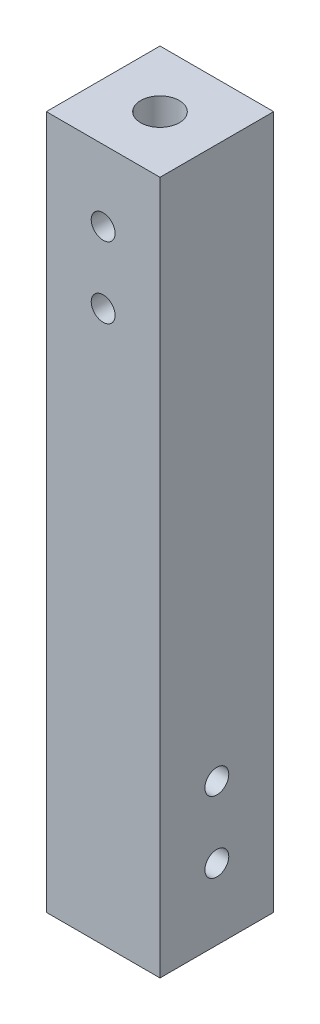
ISO-10303-21;
HEADER;
FILE_DESCRIPTION(('STEP AP214'),'2;1');
FILE_NAME('part.step','',(''),(''),'','','');
FILE_SCHEMA(('AUTOMOTIVE_DESIGN { 1 0 10303 214 1 1 1 1 }'));
ENDSEC;
DATA;
#1=APPLICATION_CONTEXT('core data for automotive mechanical design processes');
#2=APPLICATION_PROTOCOL_DEFINITION('international standard','automotive_design',2000,#1);
#3=PRODUCT_CONTEXT('',#1,'mechanical');
#4=PRODUCT('Part','Part','',(#3));
#5=PRODUCT_RELATED_PRODUCT_CATEGORY('part','',(#4));
#6=PRODUCT_DEFINITION_FORMATION('','',#4);
#7=PRODUCT_DEFINITION_CONTEXT('part definition',#1,'design');
#8=PRODUCT_DEFINITION('design','',#6,#7);
#9=PRODUCT_DEFINITION_SHAPE('','',#8);
#10=(LENGTH_UNIT() NAMED_UNIT(*) SI_UNIT(.MILLI.,.METRE.));
#11=(NAMED_UNIT(*) PLANE_ANGLE_UNIT() SI_UNIT($,.RADIAN.));
#12=(NAMED_UNIT(*) SI_UNIT($,.STERADIAN.) SOLID_ANGLE_UNIT());
#13=UNCERTAINTY_MEASURE_WITH_UNIT(LENGTH_MEASURE(1.E-05),#10,'distance_accuracy_value','');
#14=(GEOMETRIC_REPRESENTATION_CONTEXT(3) GLOBAL_UNCERTAINTY_ASSIGNED_CONTEXT((#13)) GLOBAL_UNIT_ASSIGNED_CONTEXT((#10,
#11,#12)) REPRESENTATION_CONTEXT('',''));
#15=CARTESIAN_POINT('',(0.,0.,0.));
#16=DIRECTION('',(0.,0.,1.));
#17=DIRECTION('',(1.,0.,0.));
#18=AXIS2_PLACEMENT_3D('',#15,#16,#17);
#19=CARTESIAN_POINT('',(0.,122.,0.));
#20=DIRECTION('',(0.,0.,-1.));
#21=DIRECTION('',(-1.,0.,0.));
#22=AXIS2_PLACEMENT_3D('',#19,#20,#21);
#23=PLANE('',#22);
#24=CARTESIAN_POINT('',(10.,97.,0.));
#25=DIRECTION('',(0.,0.,1.));
#26=DIRECTION('',(1.,0.,0.));
#27=AXIS2_PLACEMENT_3D('',#24,#25,#26);
#28=CIRCLE('',#27,2.1);
#29=CARTESIAN_POINT('',(12.1,97.,0.));
#30=VERTEX_POINT('',#29);
#31=EDGE_CURVE('E142',#30,#30,#28,.T.);
#32=ORIENTED_EDGE('',*,*,#31,.F.);
#33=EDGE_LOOP('',(#32));
#34=FACE_BOUND('',#33,.T.);
#35=DIRECTION('',(1.,0.,0.));
#36=VECTOR('',#35,1.);
#37=CARTESIAN_POINT('',(0.,0.,0.));
#38=LINE('',#37,#36);
#39=CARTESIAN_POINT('',(0.,0.,0.));
#40=VERTEX_POINT('',#39);
#41=CARTESIAN_POINT('',(20.,0.,0.));
#42=VERTEX_POINT('',#41);
#43=EDGE_CURVE('E187',#40,#42,#38,.T.);
#44=ORIENTED_EDGE('',*,*,#43,.T.);
#45=DIRECTION('',(0.,-1.,0.));
#46=VECTOR('',#45,1.);
#47=CARTESIAN_POINT('',(20.,122.,0.));
#48=LINE('',#47,#46);
#49=CARTESIAN_POINT('',(20.,122.,0.));
#50=VERTEX_POINT('',#49);
#51=EDGE_CURVE('E61',#50,#42,#48,.T.);
#52=ORIENTED_EDGE('',*,*,#51,.F.);
#53=DIRECTION('',(1.,0.,0.));
#54=VECTOR('',#53,1.);
#55=CARTESIAN_POINT('',(0.,122.,0.));
#56=LINE('',#55,#54);
#57=CARTESIAN_POINT('',(0.,122.,0.));
#58=VERTEX_POINT('',#57);
#59=EDGE_CURVE('E101',#58,#50,#56,.T.);
#60=ORIENTED_EDGE('',*,*,#59,.F.);
#61=DIRECTION('',(0.,-1.,0.));
#62=VECTOR('',#61,1.);
#63=CARTESIAN_POINT('',(0.,122.,0.));
#64=LINE('',#63,#62);
#65=EDGE_CURVE('E11',#58,#40,#64,.T.);
#66=ORIENTED_EDGE('',*,*,#65,.T.);
#67=EDGE_LOOP('',(#44,#52,#60,#66));
#68=FACE_BOUND('',#67,.T.);
#69=CARTESIAN_POINT('',(10.,109.5,0.));
#70=DIRECTION('',(0.,0.,1.));
#71=DIRECTION('',(1.,0.,0.));
#72=AXIS2_PLACEMENT_3D('',#69,#70,#71);
#73=CIRCLE('',#72,2.1);
#74=CARTESIAN_POINT('',(12.1,109.5,0.));
#75=VERTEX_POINT('',#74);
#76=EDGE_CURVE('E150',#75,#75,#73,.T.);
#77=ORIENTED_EDGE('',*,*,#76,.F.);
#78=EDGE_LOOP('',(#77));
#79=FACE_BOUND('',#78,.T.);
#80=ADVANCED_FACE('F45',(#34,#68,#79),#23,.F.);
#81=CARTESIAN_POINT('',(0.,122.,0.));
#82=DIRECTION('',(1.,0.,0.));
#83=DIRECTION('',(0.,0.,-1.));
#84=AXIS2_PLACEMENT_3D('',#81,#82,#83);
#85=PLANE('',#84);
#86=DIRECTION('',(0.,0.,1.));
#87=VECTOR('',#86,1.);
#88=CARTESIAN_POINT('',(0.,0.,0.));
#89=LINE('',#88,#87);
#90=CARTESIAN_POINT('',(0.,0.,-20.));
#91=VERTEX_POINT('',#90);
#92=EDGE_CURVE('E172',#91,#40,#89,.T.);
#93=ORIENTED_EDGE('',*,*,#92,.T.);
#94=ORIENTED_EDGE('',*,*,#65,.F.);
#95=DIRECTION('',(0.,0.,1.));
#96=VECTOR('',#95,1.);
#97=CARTESIAN_POINT('',(0.,122.,0.));
#98=LINE('',#97,#96);
#99=CARTESIAN_POINT('',(0.,122.,-20.));
#100=VERTEX_POINT('',#99);
#101=EDGE_CURVE('E173',#100,#58,#98,.T.);
#102=ORIENTED_EDGE('',*,*,#101,.F.);
#103=DIRECTION('',(0.,-1.,0.));
#104=VECTOR('',#103,1.);
#105=CARTESIAN_POINT('',(0.,122.,-20.));
#106=LINE('',#105,#104);
#107=EDGE_CURVE('E183',#100,#91,#106,.T.);
#108=ORIENTED_EDGE('',*,*,#107,.T.);
#109=EDGE_LOOP('',(#93,#94,#102,#108));
#110=FACE_BOUND('',#109,.T.);
#111=ADVANCED_FACE('F47',(#110),#85,.F.);
#112=CARTESIAN_POINT('',(20.,122.,0.));
#113=DIRECTION('',(-1.,0.,0.));
#114=DIRECTION('',(0.,0.,1.));
#115=AXIS2_PLACEMENT_3D('',#112,#113,#114);
#116=PLANE('',#115);
#117=CARTESIAN_POINT('',(20.,25.,-10.));
#118=DIRECTION('',(1.,0.,0.));
#119=DIRECTION('',(0.,0.,-1.));
#120=AXIS2_PLACEMENT_3D('',#117,#118,#119);
#121=CIRCLE('',#120,2.09999999999999);
#122=CARTESIAN_POINT('',(20.,25.,-12.1));
#123=VERTEX_POINT('',#122);
#124=EDGE_CURVE('E132',#123,#123,#121,.T.);
#125=ORIENTED_EDGE('',*,*,#124,.F.);
#126=EDGE_LOOP('',(#125));
#127=FACE_BOUND('',#126,.T.);
#128=CARTESIAN_POINT('',(20.,12.5,-10.));
#129=DIRECTION('',(1.,0.,0.));
#130=DIRECTION('',(0.,0.,-1.));
#131=AXIS2_PLACEMENT_3D('',#128,#129,#130);
#132=CIRCLE('',#131,2.09999999999999);
#133=CARTESIAN_POINT('',(20.,12.5,-12.1));
#134=VERTEX_POINT('',#133);
#135=EDGE_CURVE('E131',#134,#134,#132,.T.);
#136=ORIENTED_EDGE('',*,*,#135,.F.);
#137=EDGE_LOOP('',(#136));
#138=FACE_BOUND('',#137,.T.);
#139=DIRECTION('',(0.,0.,-1.));
#140=VECTOR('',#139,1.);
#141=CARTESIAN_POINT('',(20.,0.,0.));
#142=LINE('',#141,#140);
#143=CARTESIAN_POINT('',(20.,0.,-20.));
#144=VERTEX_POINT('',#143);
#145=EDGE_CURVE('E88',#42,#144,#142,.T.);
#146=ORIENTED_EDGE('',*,*,#145,.T.);
#147=DIRECTION('',(0.,-1.,0.));
#148=VECTOR('',#147,1.);
#149=CARTESIAN_POINT('',(20.,122.,-20.));
#150=LINE('',#149,#148);
#151=CARTESIAN_POINT('',(20.,122.,-20.));
#152=VERTEX_POINT('',#151);
#153=EDGE_CURVE('E196',#152,#144,#150,.T.);
#154=ORIENTED_EDGE('',*,*,#153,.F.);
#155=DIRECTION('',(0.,0.,-1.));
#156=VECTOR('',#155,1.);
#157=CARTESIAN_POINT('',(20.,122.,0.));
#158=LINE('',#157,#156);
#159=EDGE_CURVE('E178',#50,#152,#158,.T.);
#160=ORIENTED_EDGE('',*,*,#159,.F.);
#161=ORIENTED_EDGE('',*,*,#51,.T.);
#162=EDGE_LOOP('',(#146,#154,#160,#161));
#163=FACE_BOUND('',#162,.T.);
#164=ADVANCED_FACE('F258',(#127,#138,#163),#116,.F.);
#165=CARTESIAN_POINT('',(0.,122.,-20.));
#166=DIRECTION('',(0.,0.,1.));
#167=DIRECTION('',(1.,0.,0.));
#168=AXIS2_PLACEMENT_3D('',#165,#166,#167);
#169=PLANE('',#168);
#170=DIRECTION('',(-1.,0.,0.));
#171=VECTOR('',#170,1.);
#172=CARTESIAN_POINT('',(0.,0.,-20.));
#173=LINE('',#172,#171);
#174=EDGE_CURVE('E94',#144,#91,#173,.T.);
#175=ORIENTED_EDGE('',*,*,#174,.T.);
#176=ORIENTED_EDGE('',*,*,#107,.F.);
#177=DIRECTION('',(-1.,0.,0.));
#178=VECTOR('',#177,1.);
#179=CARTESIAN_POINT('',(0.,122.,-20.));
#180=LINE('',#179,#178);
#181=EDGE_CURVE('E70',#152,#100,#180,.T.);
#182=ORIENTED_EDGE('',*,*,#181,.F.);
#183=ORIENTED_EDGE('',*,*,#153,.T.);
#184=EDGE_LOOP('',(#175,#176,#182,#183));
#185=FACE_BOUND('',#184,.T.);
#186=ADVANCED_FACE('F264',(#185),#169,.F.);
#187=CARTESIAN_POINT('',(0.,122.,0.));
#188=DIRECTION('',(0.,-1.,0.));
#189=DIRECTION('',(0.,0.,-1.));
#190=AXIS2_PLACEMENT_3D('',#187,#188,#189);
#191=PLANE('',#190);
#192=CARTESIAN_POINT('',(10.,122.,-10.));
#193=DIRECTION('',(0.,1.,0.));
#194=DIRECTION('',(0.,0.,1.));
#195=AXIS2_PLACEMENT_3D('',#192,#193,#194);
#196=CIRCLE('',#195,3.39999999999999);
#197=CARTESIAN_POINT('',(10.,122.,-6.60000000000001));
#198=VERTEX_POINT('',#197);
#199=EDGE_CURVE('E164',#198,#198,#196,.T.);
#200=ORIENTED_EDGE('',*,*,#199,.F.);
#201=EDGE_LOOP('',(#200));
#202=FACE_BOUND('',#201,.T.);
#203=ORIENTED_EDGE('',*,*,#101,.T.);
#204=ORIENTED_EDGE('',*,*,#59,.T.);
#205=ORIENTED_EDGE('',*,*,#159,.T.);
#206=ORIENTED_EDGE('',*,*,#181,.T.);
#207=EDGE_LOOP('',(#203,#204,#205,#206));
#208=FACE_BOUND('',#207,.T.);
#209=ADVANCED_FACE('F268',(#202,#208),#191,.F.);
#210=CARTESIAN_POINT('',(0.,0.,0.));
#211=DIRECTION('',(0.,-1.,0.));
#212=DIRECTION('',(0.,0.,-1.));
#213=AXIS2_PLACEMENT_3D('',#210,#211,#212);
#214=PLANE('',#213);
#215=CARTESIAN_POINT('',(10.,0.,-10.));
#216=DIRECTION('',(0.,-1.,0.));
#217=DIRECTION('',(0.,0.,-1.));
#218=AXIS2_PLACEMENT_3D('',#215,#216,#217);
#219=CIRCLE('',#218,3.39999999999999);
#220=CARTESIAN_POINT('',(10.,0.,-13.4));
#221=VERTEX_POINT('',#220);
#222=EDGE_CURVE('E155',#221,#221,#219,.T.);
#223=ORIENTED_EDGE('',*,*,#222,.F.);
#224=EDGE_LOOP('',(#223));
#225=FACE_BOUND('',#224,.T.);
#226=ORIENTED_EDGE('',*,*,#92,.F.);
#227=ORIENTED_EDGE('',*,*,#174,.F.);
#228=ORIENTED_EDGE('',*,*,#145,.F.);
#229=ORIENTED_EDGE('',*,*,#43,.F.);
#230=EDGE_LOOP('',(#226,#227,#228,#229));
#231=FACE_BOUND('',#230,.T.);
#232=ADVANCED_FACE('F269',(#225,#231),#214,.T.);
#233=CARTESIAN_POINT('',(10.,102.25,-10.));
#234=DIRECTION('',(0.,1.,0.));
#235=DIRECTION('',(0.,0.,1.));
#236=AXIS2_PLACEMENT_3D('',#233,#234,#235);
#237=CONICAL_SURFACE('',#236,3.39999999999999,1.02974425867665);
#238=CARTESIAN_POINT('',(10.,100.207073895306,-10.));
#239=VERTEX_POINT('',#238);
#240=VERTEX_LOOP('',#239);
#241=FACE_BOUND('',#240,.T.);
#242=CARTESIAN_POINT('',(10.,102.25,-10.));
#243=DIRECTION('',(0.,1.,0.));
#244=DIRECTION('',(0.,0.,1.));
#245=AXIS2_PLACEMENT_3D('',#242,#243,#244);
#246=CIRCLE('',#245,3.39999999999999);
#247=CARTESIAN_POINT('',(10.,102.25,-6.60000000000001));
#248=VERTEX_POINT('',#247);
#249=EDGE_CURVE('E168',#248,#248,#246,.T.);
#250=ORIENTED_EDGE('',*,*,#249,.T.);
#251=EDGE_LOOP('',(#250));
#252=FACE_BOUND('',#251,.T.);
#253=ADVANCED_FACE('F272',(#241,#252),#237,.F.);
#254=CARTESIAN_POINT('',(10.,122.,-10.));
#255=DIRECTION('',(0.,1.,0.));
#256=DIRECTION('',(0.,0.,1.));
#257=AXIS2_PLACEMENT_3D('',#254,#255,#256);
#258=CYLINDRICAL_SURFACE('',#257,3.39999999999999);
#259=CARTESIAN_POINT('',(10.,107.4,-6.60000000000001));
#260=CARTESIAN_POINT('',(10.106909584779,107.400008305523,-6.60000759454753));
#261=CARTESIAN_POINT('',(10.2139637283466,107.408220594567,-6.60509639949891));
#262=CARTESIAN_POINT('',(10.4248054443166,107.440638101528,-6.62497197905334));
#263=CARTESIAN_POINT('',(10.5285857672476,107.46487651414,-6.63977888215416));
#264=CARTESIAN_POINT('',(10.7294054383192,107.527947623957,-6.6775975045251));
#265=CARTESIAN_POINT('',(10.8264754101919,107.566708007609,-6.70056854105657));
#266=CARTESIAN_POINT('',(11.0124068170342,107.657247481206,-6.75279017119617));
#267=CARTESIAN_POINT('',(11.1012694815828,107.709024616703,-6.78203982198289));
#268=CARTESIAN_POINT('',(11.2761942855193,107.828645056241,-6.84711126815642));
#269=CARTESIAN_POINT('',(11.3614824432051,107.897433578353,-6.88326950093502));
#270=CARTESIAN_POINT('',(11.5200639802845,108.046966603004,-6.95745373463822));
#271=CARTESIAN_POINT('',(11.5933411812988,108.127726957035,-6.99548216652543));
#272=CARTESIAN_POINT('',(11.7356266357533,108.311378393118,-7.07509364794456));
#273=CARTESIAN_POINT('',(11.8028037152635,108.415783237985,-7.11648579846967));
#274=CARTESIAN_POINT('',(11.9184431569926,108.6368282791,-7.19208892783605));
#275=CARTESIAN_POINT('',(11.966936812201,108.753447596787,-7.22631187016599));
#276=CARTESIAN_POINT('',(12.0330489780256,108.965475604978,-7.27457460141852));
#277=CARTESIAN_POINT('',(12.0553814632939,109.058746125609,-7.2915331204916));
#278=CARTESIAN_POINT('',(12.0871147107371,109.248631669755,-7.31590483461945));
#279=CARTESIAN_POINT('',(12.0965330713176,109.345241957536,-7.32333101874547));
#280=CARTESIAN_POINT('',(12.1018799243419,109.539309491384,-7.32752621478395));
#281=CARTESIAN_POINT('',(12.0977758626191,109.636768217184,-7.32426950856294));
#282=CARTESIAN_POINT('',(12.0762800260878,109.829340632346,-7.30755972114127));
#283=CARTESIAN_POINT('',(12.0588777796012,109.924452412643,-7.29409860452696));
#284=CARTESIAN_POINT('',(12.0122310678369,110.108057041321,-7.25924428337621));
#285=CARTESIAN_POINT('',(11.9832268862627,110.196643425328,-7.23801272610408));
#286=CARTESIAN_POINT('',(11.9144943411792,110.367891406903,-7.18993475740746));
#287=CARTESIAN_POINT('',(11.8747621484179,110.450550875562,-7.16308634187592));
#288=CARTESIAN_POINT('',(11.7773200977145,110.623713906336,-7.10085345842752));
#289=CARTESIAN_POINT('',(11.7176495762249,110.712875947301,-7.06480653009434));
#290=CARTESIAN_POINT('',(11.5857435319882,110.88088464287,-6.99149142415716));
#291=CARTESIAN_POINT('',(11.5134953298841,110.959720746166,-6.95422204528827));
#292=CARTESIAN_POINT('',(11.345051886795,111.117451277202,-6.87577897707394));
#293=CARTESIAN_POINT('',(11.2468776589488,111.194408717777,-6.83491188390568));
#294=CARTESIAN_POINT('',(11.0365789119404,111.330619808723,-6.7599475152374));
#295=CARTESIAN_POINT('',(10.9244605763262,111.389881267049,-6.7258472562585));
#296=CARTESIAN_POINT('',(10.6956810599504,111.485063327626,-6.66997298784579));
#297=CARTESIAN_POINT('',(10.5796453934954,111.522124016793,-6.64760605530692));
#298=CARTESIAN_POINT('',(10.3413214514468,111.575658335439,-6.61504875173137));
#299=CARTESIAN_POINT('',(10.2190418461388,111.592159745408,-6.60484195027673));
#300=CARTESIAN_POINT('',(9.99098055767567,111.602622588534,-6.59837982713387));
#301=CARTESIAN_POINT('',(9.88537226897436,111.599500370296,-6.60031923792769));
#302=CARTESIAN_POINT('',(9.6764346504061,111.577578372687,-6.61381406535332));
#303=CARTESIAN_POINT('',(9.57310520186383,111.558779411704,-6.62536898001819));
#304=CARTESIAN_POINT('',(9.37514682429582,111.507402831407,-6.65645886027859));
#305=CARTESIAN_POINT('',(9.28034069999318,111.475323097532,-6.67570467572283));
#306=CARTESIAN_POINT('',(9.09753119340588,111.398783303796,-6.72060692992851));
#307=CARTESIAN_POINT('',(9.00952900698896,111.354321073865,-6.74626449228703));
#308=CARTESIAN_POINT('',(8.83308855573479,111.249260648734,-6.80503157314831));
#309=CARTESIAN_POINT('',(8.74552197930607,111.18747893074,-6.83863432502226));
#310=CARTESIAN_POINT('',(8.5813673271781,111.052039437268,-6.90880785768253));
#311=CARTESIAN_POINT('',(8.50479187869469,110.978368205556,-6.94538197781454));
#312=CARTESIAN_POINT('',(8.35361947386744,110.809219650511,-7.02381844852095));
#313=CARTESIAN_POINT('',(8.2808240525245,110.712132318538,-7.06569927302229));
#314=CARTESIAN_POINT('',(8.15237135431422,110.505502691092,-7.14483572716954));
#315=CARTESIAN_POINT('',(8.09670021678825,110.395970567493,-7.18209508284697));
#316=CARTESIAN_POINT('',(8.01444407675157,110.190691177034,-7.23964919733964));
#317=CARTESIAN_POINT('',(7.98419234142479,110.096959655443,-7.26186640457537));
#318=CARTESIAN_POINT('',(7.9369779012554,109.904613054782,-7.29725611424553));
#319=CARTESIAN_POINT('',(7.91999502577463,109.806005631416,-7.31044234133016));
#320=CARTESIAN_POINT('',(7.90025925943216,109.605972416497,-7.32581587597081));
#321=CARTESIAN_POINT('',(7.89757893623707,109.504534872392,-7.32794709157044));
#322=CARTESIAN_POINT('',(7.90684573577772,109.302727813785,-7.32068414315933));
#323=CARTESIAN_POINT('',(7.91879888170084,109.202358756233,-7.31128523330511));
#324=CARTESIAN_POINT('',(7.95518276990628,109.012772273396,-7.28353404884088));
#325=CARTESIAN_POINT('',(7.97867463354936,108.923267474567,-7.26585955475902));
#326=CARTESIAN_POINT('',(8.03655154179377,108.749488171899,-7.22400636533244));
#327=CARTESIAN_POINT('',(8.07094092886699,108.665215769117,-7.19982507772511));
#328=CARTESIAN_POINT('',(8.15546079444473,108.490838511991,-7.14332043608681));
#329=CARTESIAN_POINT('',(8.20716896205402,108.401720741574,-7.11032149883882));
#330=CARTESIAN_POINT('',(8.32248061149128,108.232551475741,-7.04188678679635));
#331=CARTESIAN_POINT('',(8.38609387468983,108.152507522944,-7.0064490234797));
#332=CARTESIAN_POINT('',(8.53738396569216,107.988231108783,-6.92929353068202));
#333=CARTESIAN_POINT('',(8.62733638960322,107.906039079298,-6.88764735306933));
#334=CARTESIAN_POINT('',(8.82147085875536,107.757583310815,-6.80906655444782));
#335=CARTESIAN_POINT('',(8.9256604722115,107.691328095578,-6.77213445968673));
#336=CARTESIAN_POINT('',(9.14545906166428,107.577797684186,-6.70717367338645));
#337=CARTESIAN_POINT('',(9.26096135551535,107.530363121331,-6.67907066267851));
#338=CARTESIAN_POINT('',(9.44038217167056,107.474967262633,-6.6458157208623));
#339=CARTESIAN_POINT('',(9.5011547440312,107.459135760246,-6.63621903883405));
#340=CARTESIAN_POINT('',(9.62426510173868,107.432931721919,-6.62025743287795));
#341=CARTESIAN_POINT('',(9.68660164900956,107.422555002347,-6.61389003233458));
#342=CARTESIAN_POINT('',(9.79088936651453,107.410018690129,-6.60618099421612));
#343=CARTESIAN_POINT('',(9.83258597172239,107.406265917294,-6.60386732476643));
#344=CARTESIAN_POINT('',(9.91618096797896,107.401254869897,-6.60077529316418));
#345=CARTESIAN_POINT('',(9.95807937084904,107.399996743297,-6.59999702207983));
#346=CARTESIAN_POINT('',(10.,107.4,-6.60000000000001));
#347=B_SPLINE_CURVE_WITH_KNOTS('',3,(#259,#260,#261,#262,#263,#264,#265,#266,#267,#268,#269,
#270,#271,#272,#273,#274,#275,#276,#277,#278,#279,#280,#281,#282,#283,#284,#285,#286,#287,#288,
#289,#290,#291,#292,#293,#294,#295,#296,#297,#298,#299,#300,#301,#302,#303,#304,#305,#306,#307,
#308,#309,#310,#311,#312,#313,#314,#315,#316,#317,#318,#319,#320,#321,#322,#323,#324,#325,#326,
#327,#328,#329,#330,#331,#332,#333,#334,#335,#336,#337,#338,#339,#340,#341,#342,#343,#344,#345,
#346),.UNSPECIFIED.,.T.,.F.,(4,2,2,2,2,2,2,2,2,2,2,2,2,2,2,2,2,2,2,2,2,2,2,2,2,2,2,2,2,2,2,2,2,
2,2,2,2,2,2,2,2,2,2,4),(0.,0.32055939799291,0.641784855166923,0.96143155178874,1.28103028254197,
1.62584215223705,1.97111472233271,2.36182992370453,2.75188783882832,3.04285199801865,
3.33341925757461,3.62468654554337,3.91618342908429,4.20193227813959,4.48778325741514,
4.82605714883407,5.16467404450682,5.55649371866594,5.94814025488062,6.31741099530855,
6.68618221984858,7.00158556440317,7.31697244470076,7.62147541781029,7.92603178960802,
8.26166323151342,8.59767723091423,8.9810716433439,9.36415490885001,9.66584505458906,
9.96707568932733,10.2698332517716,10.5727154722024,10.8542488166005,11.1358944884696,
11.4592882598546,11.7829489113393,12.1674427472299,12.5521417735468,12.9335099840298,
13.1238232547395,13.3139903479583,13.4396783739624,13.5653738546052),.UNSPECIFIED.);
#348=CARTESIAN_POINT('',(10.,107.4,-6.60000000000001));
#349=VERTEX_POINT('',#348);
#350=EDGE_CURVE('E160',#349,#349,#347,.T.);
#351=ORIENTED_EDGE('',*,*,#350,.T.);
#352=EDGE_LOOP('',(#351));
#353=FACE_BOUND('',#352,.T.);
#354=CARTESIAN_POINT('',(9.63129406855636,109.790003670071,-13.3799491025928));
#355=CARTESIAN_POINT('',(9.65111356220238,109.809380421139,-13.3821108680188));
#356=CARTESIAN_POINT('',(9.67267078952989,109.827019082777,-13.3842845231953));
#357=CARTESIAN_POINT('',(9.71844397164154,109.858522060881,-13.3884002305228));
#358=CARTESIAN_POINT('',(9.74266620773806,109.87237718026,-13.3903417119818));
#359=CARTESIAN_POINT('',(9.79321935917377,109.896192212367,-13.3938014041982));
#360=CARTESIAN_POINT('',(9.81956554728726,109.906120187738,-13.3953161167871));
#361=CARTESIAN_POINT('',(9.87348132810253,109.921785671952,-13.3977523930356));
#362=CARTESIAN_POINT('',(9.90105036784803,109.927525054736,-13.398674221924));
#363=CARTESIAN_POINT('',(9.95882739123458,109.935013328223,-13.3998822311503));
#364=CARTESIAN_POINT('',(9.98907940766684,109.936434553324,-13.4001161755556));
#365=CARTESIAN_POINT('',(10.0494157466226,109.934337342914,-13.3997748620723));
#366=CARTESIAN_POINT('',(10.0795000052387,109.930817138936,-13.3991993144775));
#367=CARTESIAN_POINT('',(10.1391661153035,109.918788524235,-13.3972839947183));
#368=CARTESIAN_POINT('',(10.1687308300249,109.910196646301,-13.3959314452442));
#369=CARTESIAN_POINT('',(10.2259359207021,109.888089569949,-13.3926058166379));
#370=CARTESIAN_POINT('',(10.2535760386857,109.874573713031,-13.3906326545139));
#371=CARTESIAN_POINT('',(10.3053247732215,109.843229884537,-13.3863600622848));
#372=CARTESIAN_POINT('',(10.3295047610521,109.825518998046,-13.3840700932468));
#373=CARTESIAN_POINT('',(10.3741640983998,109.78590721708,-13.3794238363886));
#374=CARTESIAN_POINT('',(10.3946452446296,109.764008367609,-13.3770675814132));
#375=CARTESIAN_POINT('',(10.4291532775219,109.718690476052,-13.3728478623278));
#376=CARTESIAN_POINT('',(10.4435998158712,109.695595021257,-13.3709590223395));
#377=CARTESIAN_POINT('',(10.4676525391931,109.646978230708,-13.3677069544126));
#378=CARTESIAN_POINT('',(10.4772662625308,109.621460747292,-13.3663429086696));
#379=CARTESIAN_POINT('',(10.489931543553,109.572784958385,-13.3645210350162));
#380=CARTESIAN_POINT('',(10.493735691305,109.549825385072,-13.3639600510503));
#381=CARTESIAN_POINT('',(10.4970358771788,109.503595501625,-13.3634742080895));
#382=CARTESIAN_POINT('',(10.4965345008075,109.480325386356,-13.3635489673246));
#383=CARTESIAN_POINT('',(10.4915139462796,109.436459984065,-13.3642857906914));
#384=CARTESIAN_POINT('',(10.4873761439805,109.415818577825,-13.3648920940071));
#385=CARTESIAN_POINT('',(10.4758258715523,109.375496721164,-13.3665447420789));
#386=CARTESIAN_POINT('',(10.4684130976294,109.355816360081,-13.3675911276576));
#387=CARTESIAN_POINT('',(10.4503803211682,109.317262203343,-13.3700507964373));
#388=CARTESIAN_POINT('',(10.4396672215643,109.298432913799,-13.3714745354372));
#389=CARTESIAN_POINT('',(10.4155600589433,109.262601673968,-13.374530674952));
#390=CARTESIAN_POINT('',(10.4021649730154,109.24560042471,-13.3761631549946));
#391=CARTESIAN_POINT('',(10.3714066654576,109.211770443671,-13.3796928044248));
#392=CARTESIAN_POINT('',(10.3537616589982,109.195199095564,-13.3815984678181));
#393=CARTESIAN_POINT('',(10.316212082077,109.164843784402,-13.3853162786986));
#394=CARTESIAN_POINT('',(10.2963063651395,109.151061245583,-13.387128378053));
#395=CARTESIAN_POINT('',(10.252021017678,109.12482307555,-13.3907285236147));
#396=CARTESIAN_POINT('',(10.2273965187768,109.112775175663,-13.3924825855408));
#397=CARTESIAN_POINT('',(10.1765686976831,109.092582150752,-13.3955076991084));
#398=CARTESIAN_POINT('',(10.1503647527381,109.084438576629,-13.3967785587677));
#399=CARTESIAN_POINT('',(10.0947143069554,109.071630851665,-13.3988039234041));
#400=CARTESIAN_POINT('',(10.0651826524986,109.067325781603,-13.3995046797525));
#401=CARTESIAN_POINT('',(10.0058013177314,109.063510346853,-13.4001248157618));
#402=CARTESIAN_POINT('',(9.97595157087843,109.064001005877,-13.4000440285921));
#403=CARTESIAN_POINT('',(9.91581557307607,109.0698601739,-13.3990946258146));
#404=CARTESIAN_POINT('',(9.88554408424371,109.075378073537,-13.3982018833675));
#405=CARTESIAN_POINT('',(9.82637765367681,109.091416251414,-13.3956932376286));
#406=CARTESIAN_POINT('',(9.79748293623199,109.101937341678,-13.3940772169503));
#407=CARTESIAN_POINT('',(9.74228131016281,109.127676544889,-13.3903301362397));
#408=CARTESIAN_POINT('',(9.71594946454905,109.142841799933,-13.3882049279736));
#409=CARTESIAN_POINT('',(9.66645637889419,109.177677625062,-13.3836912214036));
#410=CARTESIAN_POINT('',(9.64329472456052,109.197347605553,-13.3813027575766));
#411=CARTESIAN_POINT('',(9.60264962830955,109.239329720046,-13.3767592426042));
#412=CARTESIAN_POINT('',(9.58488586411017,109.261368474165,-13.3745994116458));
#413=CARTESIAN_POINT('',(9.55400641440723,109.308523261965,-13.3706576990103));
#414=CARTESIAN_POINT('',(9.54088417535033,109.333634888914,-13.3688752858818));
#415=CARTESIAN_POINT('',(9.52163715418822,109.382495871831,-13.3661923137658));
#416=CARTESIAN_POINT('',(9.51479922166175,109.405959254633,-13.3652043035011));
#417=CARTESIAN_POINT('',(9.50573879167161,109.453772748394,-13.3638858454626));
#418=CARTESIAN_POINT('',(9.50351147568834,109.478121906519,-13.3635547112079));
#419=CARTESIAN_POINT('',(9.50380665078234,109.523789723533,-13.3635979534837));
#420=CARTESIAN_POINT('',(9.50578044876455,109.545114043643,-13.3638908346114));
#421=CARTESIAN_POINT('',(9.51327853966968,109.587118035033,-13.3649838657497));
#422=CARTESIAN_POINT('',(9.5188036541672,109.607797555982,-13.3657841331403));
#423=CARTESIAN_POINT('',(9.53306136239878,109.647827382214,-13.3677914447594));
#424=CARTESIAN_POINT('',(9.54177215783466,109.667185684219,-13.3689957200044));
#425=CARTESIAN_POINT('',(9.5620152191487,109.704320095456,-13.3716869558394));
#426=CARTESIAN_POINT('',(9.57354520103199,109.722097469673,-13.3731736873781));
#427=CARTESIAN_POINT('',(9.59312155409623,109.748008778295,-13.3755736614268));
#428=CARTESIAN_POINT('',(9.60031796746935,109.756805039715,-13.3764347026831));
#429=CARTESIAN_POINT('',(9.61534376985397,109.773832626371,-13.3781795342506));
#430=CARTESIAN_POINT('',(9.62317304111476,109.782064056175,-13.379063320309));
#431=CARTESIAN_POINT('',(9.63129406855636,109.790003670071,-13.3799491025928));
#432=B_SPLINE_CURVE_WITH_KNOTS('',3,(#354,#355,#356,#357,#358,#359,#360,#361,#362,#363,#364,
#365,#366,#367,#368,#369,#370,#371,#372,#373,#374,#375,#376,#377,#378,#379,#380,#381,#382,#383,
#384,#385,#386,#387,#388,#389,#390,#391,#392,#393,#394,#395,#396,#397,#398,#399,#400,#401,#402,
#403,#404,#405,#406,#407,#408,#409,#410,#411,#412,#413,#414,#415,#416,#417,#418,#419,#420,#421,
#422,#423,#424,#425,#426,#427,#428,#429,#430,#431),.UNSPECIFIED.,.T.,.F.,(4,2,2,2,2,2,2,2,2,2,2,
2,2,2,2,2,2,2,2,2,2,2,2,2,2,2,2,2,2,2,2,2,2,2,2,2,2,2,4),(0.,0.0833631966671309,
0.166927265543383,0.251157593237054,0.335350213894606,0.425789442183187,0.516261045655685,
0.608264813697491,0.70028089024059,0.789981171464596,0.879637762883284,0.961072187196758,
1.04237919049897,1.11182749231665,1.18123409270769,1.24412875514776,1.30702925306261,
1.37189791817485,1.43679137151762,1.50934692193137,1.58193943318538,1.66400305275113,
1.74609924318749,1.83524932101319,1.9244184295165,2.01632692581222,2.10825034407709,
2.19916414166348,2.29006604692464,2.37473953833025,2.45929299411102,2.5322429708447,
2.60511666955324,2.66905873976174,2.73301560788997,2.79654279242138,2.86001867925432,
2.89418304880925,2.92834107624649),.UNSPECIFIED.);
#433=CARTESIAN_POINT('',(9.63129406855636,109.790003670071,-13.3799491025928));
#434=VERTEX_POINT('',#433);
#435=EDGE_CURVE('E154',#434,#434,#432,.T.);
#436=ORIENTED_EDGE('',*,*,#435,.T.);
#437=EDGE_LOOP('',(#436));
#438=FACE_BOUND('',#437,.T.);
#439=ORIENTED_EDGE('',*,*,#249,.F.);
#440=EDGE_LOOP('',(#439));
#441=FACE_BOUND('',#440,.T.);
#442=ORIENTED_EDGE('',*,*,#199,.T.);
#443=EDGE_LOOP('',(#442));
#444=FACE_BOUND('',#443,.T.);
#445=ADVANCED_FACE('F213',(#353,#438,#441,#444),#258,.F.);
#446=CARTESIAN_POINT('',(10.,19.75,-10.));
#447=DIRECTION('',(0.,-1.,0.));
#448=DIRECTION('',(0.,0.,-1.));
#449=AXIS2_PLACEMENT_3D('',#446,#447,#448);
#450=CONICAL_SURFACE('',#449,3.39999999999999,1.02974425867665);
#451=CARTESIAN_POINT('',(10.,21.7929261046937,-10.));
#452=VERTEX_POINT('',#451);
#453=VERTEX_LOOP('',#452);
#454=FACE_BOUND('',#453,.T.);
#455=CARTESIAN_POINT('',(10.,19.75,-10.));
#456=DIRECTION('',(0.,-1.,0.));
#457=DIRECTION('',(0.,0.,-1.));
#458=AXIS2_PLACEMENT_3D('',#455,#456,#457);
#459=CIRCLE('',#458,3.39999999999999);
#460=CARTESIAN_POINT('',(10.,19.75,-13.4));
#461=VERTEX_POINT('',#460);
#462=EDGE_CURVE('E159',#461,#461,#459,.T.);
#463=ORIENTED_EDGE('',*,*,#462,.T.);
#464=EDGE_LOOP('',(#463));
#465=FACE_BOUND('',#464,.T.);
#466=ADVANCED_FACE('F227',(#454,#465),#450,.F.);
#467=CARTESIAN_POINT('',(10.,0.,-10.));
#468=DIRECTION('',(0.,-1.,0.));
#469=DIRECTION('',(0.,0.,-1.));
#470=AXIS2_PLACEMENT_3D('',#467,#468,#469);
#471=CYLINDRICAL_SURFACE('',#470,3.39999999999999);
#472=CARTESIAN_POINT('',(12.6739483914242,12.5,-12.1));
#473=CARTESIAN_POINT('',(12.6739610113809,12.6046790422649,-12.0999918862109));
#474=CARTESIAN_POINT('',(12.6802093934933,12.7095349338581,-12.0921018484001));
#475=CARTESIAN_POINT('',(12.7041179400223,12.9157500842561,-12.0610919822798));
#476=CARTESIAN_POINT('',(12.7218106974976,13.0170984826818,-12.03792865267));
#477=CARTESIAN_POINT('',(12.7656635883293,13.212687802904,-11.9779929515485));
#478=CARTESIAN_POINT('',(12.7917515972957,13.3069811221234,-11.9413361311584));
#479=CARTESIAN_POINT('',(12.8493313139399,13.4879607741085,-11.8557922033485));
#480=CARTESIAN_POINT('',(12.8808229339303,13.5746472302804,-11.8069052943872));
#481=CARTESIAN_POINT('',(12.9506272563945,13.7504142227042,-11.6908448141345));
#482=CARTESIAN_POINT('',(12.9892936162628,13.8383282426312,-11.6221166664702));
#483=CARTESIAN_POINT('',(13.066244140119,14.002364895129,-11.4714997465579));
#484=CARTESIAN_POINT('',(13.1045279499978,14.0784774066946,-11.3895997994133));
#485=CARTESIAN_POINT('',(13.1816928729535,14.2255535136014,-11.2033807878212));
#486=CARTESIAN_POINT('',(13.2201215347832,14.2948775370383,-11.0975604931066));
#487=CARTESIAN_POINT('',(13.2881161066096,14.4141866571041,-10.8729325645918));
#488=CARTESIAN_POINT('',(13.3176906093381,14.4641905172374,-10.7541376761469));
#489=CARTESIAN_POINT('',(13.3619898388173,14.5380765317753,-10.5194501278611));
#490=CARTESIAN_POINT('',(13.3779023013162,14.5640681175731,-10.4044517052661));
#491=CARTESIAN_POINT('',(13.3977266634575,14.5963582842278,-10.1707458527));
#492=CARTESIAN_POINT('',(13.4016507757289,14.6026769062171,-10.0520423218078));
#493=CARTESIAN_POINT('',(13.3973621468313,14.5957252227632,-9.83111484709011));
#494=CARTESIAN_POINT('',(13.3906738354962,14.5849156093678,-9.72877157867804));
#495=CARTESIAN_POINT('',(13.3685524008778,14.5487437034368,-9.52768240010947));
#496=CARTESIAN_POINT('',(13.3531186165895,14.5233803108879,-9.42893676247153));
#497=CARTESIAN_POINT('',(13.3147611731353,14.4591591905625,-9.2371294578897));
#498=CARTESIAN_POINT('',(13.2918109413459,14.4202535562897,-9.14408936760809));
#499=CARTESIAN_POINT('',(13.240216227837,14.330396912274,-8.9657727888472));
#500=CARTESIAN_POINT('',(13.2115703972853,14.2794430487265,-8.88049814636993));
#501=CARTESIAN_POINT('',(13.1468103551656,14.1598943130799,-8.70887822165667));
#502=CARTESIAN_POINT('',(13.110210899813,14.0899002874422,-8.62369211380303));
#503=CARTESIAN_POINT('',(13.0353070639468,13.9378696879567,-8.46553324266295));
#504=CARTESIAN_POINT('',(12.9970003058399,13.8558159298707,-8.39257823072271));
#505=CARTESIAN_POINT('',(12.9172699365886,13.6697924521677,-8.25160644067956));
#506=CARTESIAN_POINT('',(12.8760633094271,13.5643637183163,-8.18537563860498));
#507=CARTESIAN_POINT('',(12.8012350353127,13.3413426628532,-8.07186022026546));
#508=CARTESIAN_POINT('',(12.7675994144318,13.223773344487,-8.02454057203247));
#509=CARTESIAN_POINT('',(12.7208691431286,13.0108290962125,-7.96088034392542));
#510=CARTESIAN_POINT('',(12.7047118444924,12.9175782569115,-7.93969282147629));
#511=CARTESIAN_POINT('',(12.6820051729033,12.7279605332538,-7.91021323543647));
#512=CARTESIAN_POINT('',(12.6754432686795,12.6315978813246,-7.90190435191258));
#513=CARTESIAN_POINT('',(12.6729104384627,12.4383121114321,-7.89867751792015));
#514=CARTESIAN_POINT('',(12.6769607180975,12.3413882580298,-7.90378637929588));
#515=CARTESIAN_POINT('',(12.6950614050933,12.1500630856571,-7.92711560222271));
#516=CARTESIAN_POINT('',(12.7091200074543,12.0556638996974,-7.94534670864642));
#517=CARTESIAN_POINT('',(12.7450682555591,11.8728091144794,-7.99363976553353));
#518=CARTESIAN_POINT('',(12.7668645006656,11.7842969648962,-8.02356102035896));
#519=CARTESIAN_POINT('',(12.8159349110133,11.6133144224336,-8.09412642881083));
#520=CARTESIAN_POINT('',(12.8432110496868,11.5308462207589,-8.13477444704282));
#521=CARTESIAN_POINT('',(12.9063404658083,11.3578657703768,-8.23441892944317));
#522=CARTESIAN_POINT('',(12.9428427274776,11.2687487177414,-8.29542726120126));
#523=CARTESIAN_POINT('',(13.0168519494701,11.1010496492953,-8.43012020496834));
#524=CARTESIAN_POINT('',(13.054359899438,11.022478504535,-8.50381772148511));
#525=CARTESIAN_POINT('',(13.1328154767844,10.8660539623924,-8.67500661525419));
#526=CARTESIAN_POINT('',(13.1734271197786,10.7901009318167,-8.77441051895032));
#527=CARTESIAN_POINT('',(13.2475568998873,10.6561635998003,-8.98707116473593));
#528=CARTESIAN_POINT('',(13.2810788277191,10.5981696882674,-9.10032045261942));
#529=CARTESIAN_POINT('',(13.3353363755056,10.5060689587725,-9.33024899176577));
#530=CARTESIAN_POINT('',(13.3567541488414,10.4706687092271,-9.44624245705891));
#531=CARTESIAN_POINT('',(13.3874057558049,10.4203541943052,-9.68409821455823));
#532=CARTESIAN_POINT('',(13.3966555087029,10.4054131613394,-9.80595262205691));
#533=CARTESIAN_POINT('',(13.4014597623096,10.3976384670894,-10.0330383947485));
#534=CARTESIAN_POINT('',(13.3987889817109,10.4019401913647,-10.1381460376771));
#535=CARTESIAN_POINT('',(13.3839630939261,10.4260428241202,-10.3458728477989));
#536=CARTESIAN_POINT('',(13.3718082345418,10.4458433276457,-10.4484920799375));
#537=CARTESIAN_POINT('',(13.3396154688397,10.4991340110817,-10.6454911504911));
#538=CARTESIAN_POINT('',(13.3198153371844,10.532212362581,-10.7400233456937));
#539=CARTESIAN_POINT('',(13.2739090433057,10.6106901269537,-10.922143552682));
#540=CARTESIAN_POINT('',(13.2478017369723,10.6560917754356,-11.0097303007431));
#541=CARTESIAN_POINT('',(13.1881238288334,10.7632436410302,-11.1854800532095));
#542=CARTESIAN_POINT('',(13.1540563289321,10.8262136512459,-11.2727280617522));
#543=CARTESIAN_POINT('',(13.0831244438956,10.9640474197628,-11.4360679887891));
#544=CARTESIAN_POINT('',(13.0462568771564,11.0389248168529,-11.5121469196131));
#545=CARTESIAN_POINT('',(12.9674989061893,11.2105546571169,-11.6619450439946));
#546=CARTESIAN_POINT('',(12.9256248935749,11.3089014658815,-11.7338562184168));
#547=CARTESIAN_POINT('',(12.8469003300844,11.518071264668,-11.8602991106615));
#548=CARTESIAN_POINT('',(12.8100465287888,11.6288860963634,-11.9148421047012));
#549=CARTESIAN_POINT('',(12.7539696421629,11.8352455007145,-11.9943606043632));
#550=CARTESIAN_POINT('',(12.7326491293437,11.928726344706,-12.0232107820716));
#551=CARTESIAN_POINT('',(12.6991564682664,12.1202149923477,-12.0676922720582));
#552=CARTESIAN_POINT('',(12.6869547102251,12.2182070373912,-12.0833663895992));
#553=CARTESIAN_POINT('',(12.678123788191,12.3474268383536,-12.0946737200208));
#554=CARTESIAN_POINT('',(12.6765623606121,12.3778791296385,-12.0966682254729));
#555=CARTESIAN_POINT('',(12.6744727064262,12.4388825741913,-12.0993326953104));
#556=CARTESIAN_POINT('',(12.6739447064002,12.4694337476689,-12.1000023692242));
#557=CARTESIAN_POINT('',(12.6739483914242,12.5,-12.1));
#558=B_SPLINE_CURVE_WITH_KNOTS('',3,(#472,#473,#474,#475,#476,#477,#478,#479,#480,#481,#482,
#483,#484,#485,#486,#487,#488,#489,#490,#491,#492,#493,#494,#495,#496,#497,#498,#499,#500,#501,
#502,#503,#504,#505,#506,#507,#508,#509,#510,#511,#512,#513,#514,#515,#516,#517,#518,#519,#520,
#521,#522,#523,#524,#525,#526,#527,#528,#529,#530,#531,#532,#533,#534,#535,#536,#537,#538,#539,
#540,#541,#542,#543,#544,#545,#546,#547,#548,#549,#550,#551,#552,#553,#554,#555,#556,#557),
.UNSPECIFIED.,.T.,.F.,(4,2,2,2,2,2,2,2,2,2,2,2,2,2,2,2,2,2,2,2,2,2,2,2,2,2,2,2,2,2,2,2,2,2,2,2,
2,2,2,2,2,2,4),(0.,0.313896674080757,0.628691271189521,0.940850572197424,1.25300480810622,
1.60593606393233,1.9591683401123,2.35365557858265,2.74775872708062,3.10251754660727,
3.45691484975306,3.76482728319473,4.07276299254452,4.38179930392575,4.69090888867311,
5.03805048771669,5.38569162203661,5.77721782858878,6.16801535263559,6.45774015320213,
6.74708624369568,7.03701095616054,7.32717333780364,7.61394604878348,7.9008222187478,
8.24154006992771,8.58260648958722,8.97518072262445,9.36754452107267,9.73474456608873,
10.1014637284882,10.4155612411155,10.7296505472233,11.0346698888152,11.3397446019588,
11.6770205140648,12.0146855639624,12.3994308421803,12.7839258144403,13.0831499023243,
13.3813980978601,13.4730357532148,13.5646934980532),.UNSPECIFIED.);
#559=CARTESIAN_POINT('',(12.6739483914242,12.5,-12.1));
#560=VERTEX_POINT('',#559);
#561=EDGE_CURVE('E49',#560,#560,#558,.T.);
#562=ORIENTED_EDGE('',*,*,#561,.T.);
#563=EDGE_LOOP('',(#562));
#564=FACE_BOUND('',#563,.T.);
#565=CARTESIAN_POINT('',(6.62005089740715,12.7900036700708,-10.3687059314436));
#566=CARTESIAN_POINT('',(6.62170964304524,12.7751353909424,-10.3839134451077));
#567=CARTESIAN_POINT('',(6.62336244655791,12.759234848601,-10.3981081876877));
#568=CARTESIAN_POINT('',(6.62652678146871,12.7255431026406,-10.4240867813501));
#569=CARTESIAN_POINT('',(6.62803827796808,12.7077514342745,-10.435870037715));
#570=CARTESIAN_POINT('',(6.63102679997297,12.6672326666471,-10.4584454076855));
#571=CARTESIAN_POINT('',(6.63244992119374,12.6441904750496,-10.4686888605378));
#572=CARTESIAN_POINT('',(6.63469960962611,12.596539714764,-10.4845816014742));
#573=CARTESIAN_POINT('',(6.63552652265179,12.5719320631066,-10.4902335529733));
#574=CARTESIAN_POINT('',(6.63639400164287,12.5250965937707,-10.496147134981));
#575=CARTESIAN_POINT('',(6.63651763906576,12.5029412816565,-10.4969784519946));
#576=CARTESIAN_POINT('',(6.63618533981762,12.4588409892597,-10.4947245253172));
#577=CARTESIAN_POINT('',(6.63572959844316,12.4368959406133,-10.4916406013732));
#578=CARTESIAN_POINT('',(6.63433660918579,12.3950138491194,-10.4820078498511));
#579=CARTESIAN_POINT('',(6.63342568522968,12.3750317572235,-10.4756479174256));
#580=CARTESIAN_POINT('',(6.63123792163406,12.3363273964007,-10.4598966681758));
#581=CARTESIAN_POINT('',(6.62996100410827,12.3176053966795,-10.450504706058));
#582=CARTESIAN_POINT('',(6.62707009118757,12.280553248257,-10.4283415948702));
#583=CARTESIAN_POINT('',(6.6254390728951,12.2623364251245,-10.4153840114495));
#584=CARTESIAN_POINT('',(6.62205783051497,12.2280286979647,-10.386926358987));
#585=CARTESIAN_POINT('',(6.62030755275868,12.2119387607737,-10.3714251407916));
#586=CARTESIAN_POINT('',(6.61660793948893,12.1801315618256,-10.3361710967576));
#587=CARTESIAN_POINT('',(6.61466239098367,12.1647361756784,-10.3161274610542));
#588=CARTESIAN_POINT('',(6.61098896336498,12.1370969441976,-10.273957641022));
#589=CARTESIAN_POINT('',(6.60926119173362,12.1248546519628,-10.2518304377037));
#590=CARTESIAN_POINT('',(6.60598500623749,12.102382198425,-10.2032773678272));
#591=CARTESIAN_POINT('',(6.60448300900646,12.0925698967616,-10.1766543169089));
#592=CARTESIAN_POINT('',(6.60208651983946,12.0771997476045,-10.1221808117402));
#593=CARTESIAN_POINT('',(6.60119223077499,12.0716433207728,-10.0943299509104));
#594=CARTESIAN_POINT('',(6.60006084846294,12.0646389132351,-10.0362212675451));
#595=CARTESIAN_POINT('',(6.5998712736714,12.0634878427443,-10.0059263126658));
#596=CARTESIAN_POINT('',(6.6003018152372,12.0661342790765,-9.9455558615428));
#597=CARTESIAN_POINT('',(6.60092207203019,12.0699326441978,-9.91548040427246));
#598=CARTESIAN_POINT('',(6.60292184300712,12.0825192609802,-9.85590925758733));
#599=CARTESIAN_POINT('',(6.60431333784356,12.0913863212946,-9.82643052567575));
#600=CARTESIAN_POINT('',(6.60770578227445,12.1140337861503,-9.76944625737991));
#601=CARTESIAN_POINT('',(6.6097068297964,12.127814980231,-9.74194103892774));
#602=CARTESIAN_POINT('',(6.61401592950854,12.1596452410176,-9.69054931344602));
#603=CARTESIAN_POINT('',(6.61631440178729,12.1775710587947,-9.66658602214045));
#604=CARTESIAN_POINT('',(6.62095922106973,12.2175792219074,-9.62240627899259));
#605=CARTESIAN_POINT('',(6.62330554224034,12.2396593747003,-9.60218786182896));
#606=CARTESIAN_POINT('',(6.62748325603419,12.2852287100982,-9.56826365327077));
#607=CARTESIAN_POINT('',(6.62934230740389,12.3083912752923,-9.55412478019467));
#608=CARTESIAN_POINT('',(6.63252392998669,12.3570803006625,-9.53069578454197));
#609=CARTESIAN_POINT('',(6.63384733656352,12.3826030031181,-9.52139810535287));
#610=CARTESIAN_POINT('',(6.63559024981465,12.4312176922688,-9.50930805043864));
#611=CARTESIAN_POINT('',(6.63611357012119,12.4541199972447,-9.50576369432721));
#612=CARTESIAN_POINT('',(6.63652762683094,12.5001879372646,-9.50295251857889));
#613=CARTESIAN_POINT('',(6.63641872141494,12.5233534157869,-9.503683276923));
#614=CARTESIAN_POINT('',(6.63562351679271,12.5670542241273,-9.50910619991837));
#615=CARTESIAN_POINT('',(6.63499054260863,12.5876373809976,-9.51343264554541));
#616=CARTESIAN_POINT('',(6.633290678352,12.6278167075323,-9.52533778729024));
#617=CARTESIAN_POINT('',(6.63222374426419,12.6474127768527,-9.53291681331191));
#618=CARTESIAN_POINT('',(6.62972579519085,12.6858398769985,-9.55129060513774));
#619=CARTESIAN_POINT('',(6.62828346473517,12.7046210102882,-9.56218752108079));
#620=CARTESIAN_POINT('',(6.62519721382343,12.7403317868671,-9.5866503055705));
#621=CARTESIAN_POINT('',(6.62355321526464,12.7572607079927,-9.60021720939631));
#622=CARTESIAN_POINT('',(6.62000498397651,12.7909371106459,-9.63134466678328));
#623=CARTESIAN_POINT('',(6.61809311850693,12.8074215265475,-9.64918865761765));
#624=CARTESIAN_POINT('',(6.61437279200141,12.8375735410926,-9.68712290045773));
#625=CARTESIAN_POINT('',(6.61256438447202,12.851239691529,-9.70721429918873));
#626=CARTESIAN_POINT('',(6.60898357334373,12.8771922125956,-9.75186513210723));
#627=CARTESIAN_POINT('',(6.60724633352696,12.8890690220921,-9.77666598351375));
#628=CARTESIAN_POINT('',(6.60426573328652,12.9088892287594,-9.82781969115046));
#629=CARTESIAN_POINT('',(6.60302255882525,12.9168311451436,-9.85417312748441));
#630=CARTESIAN_POINT('',(6.60106555685626,12.9291786711258,-9.91005889670103));
#631=CARTESIAN_POINT('',(6.60040517305277,12.9332298288934,-9.93967195553013));
#632=CARTESIAN_POINT('',(6.59986980815682,12.9365216533016,-9.99917520979271));
#633=CARTESIAN_POINT('',(6.59999503940583,12.9357610193775,-10.0290654779723));
#634=CARTESIAN_POINT('',(6.60103340322645,12.9293458021621,-10.0891990802314));
#635=CARTESIAN_POINT('',(6.60196966644157,12.9235475308206,-10.1194268240066));
#636=CARTESIAN_POINT('',(6.60455793200101,12.906951717604,-10.1784535702712));
#637=CARTESIAN_POINT('',(6.606209905273,12.896154378791,-10.2072526307413));
#638=CARTESIAN_POINT('',(6.60982874840378,12.8711643307101,-10.2595203011192));
#639=CARTESIAN_POINT('',(6.61174237552567,12.8574639656335,-10.283228733373));
#640=CARTESIAN_POINT('',(6.61579107142186,12.8264052960377,-10.3280787100593));
#641=CARTESIAN_POINT('',(6.61792586065506,12.8090515812529,-10.3492234232747));
#642=CARTESIAN_POINT('',(6.62005089740715,12.7900036700708,-10.3687059314436));
#643=B_SPLINE_CURVE_WITH_KNOTS('',3,(#565,#566,#567,#568,#569,#570,#571,#572,#573,#574,#575,
#576,#577,#578,#579,#580,#581,#582,#583,#584,#585,#586,#587,#588,#589,#590,#591,#592,#593,#594,
#595,#596,#597,#598,#599,#600,#601,#602,#603,#604,#605,#606,#607,#608,#609,#610,#611,#612,#613,
#614,#615,#616,#617,#618,#619,#620,#621,#622,#623,#624,#625,#626,#627,#628,#629,#630,#631,#632,
#633,#634,#635,#636,#637,#638,#639,#640,#641,#642),.UNSPECIFIED.,.T.,.F.,(4,2,2,2,2,2,2,2,2,2,2,
2,2,2,2,2,2,2,2,2,2,2,2,2,2,2,2,2,2,2,2,2,2,2,2,2,2,2,4),(0.,0.0639360328067042,
0.127887814481623,0.203209400539949,0.278487263171245,0.344652613750858,0.410795667275873,
0.473492621604758,0.536202928253269,0.603179865410094,0.670187144887202,0.745927521442812,
0.821705133899136,0.906577818910263,0.99147882310824,1.08201044438849,1.17255776714986,
1.26455278414014,1.35656258836238,1.44612543783526,1.535641150444,1.61675739485322,
1.69774664258059,1.76690300922992,1.83602019989701,1.89886157510877,1.96170932572502,
2.02673064758251,2.09177723109745,2.16459125351988,2.2374425997723,2.31975327143209,
2.40209489492102,2.49137626236645,2.58068176243529,2.67262137852196,2.76455726034758,
2.84656881825219,2.92847795270716),.UNSPECIFIED.);
#644=CARTESIAN_POINT('',(6.62005089740715,12.7900036700708,-10.3687059314436));
#645=VERTEX_POINT('',#644);
#646=EDGE_CURVE('E137',#645,#645,#643,.T.);
#647=ORIENTED_EDGE('',*,*,#646,.T.);
#648=EDGE_LOOP('',(#647));
#649=FACE_BOUND('',#648,.T.);
#650=ORIENTED_EDGE('',*,*,#462,.F.);
#651=EDGE_LOOP('',(#650));
#652=FACE_BOUND('',#651,.T.);
#653=ORIENTED_EDGE('',*,*,#222,.T.);
#654=EDGE_LOOP('',(#653));
#655=FACE_BOUND('',#654,.T.);
#656=ADVANCED_FACE('F221',(#564,#649,#652,#655),#471,.F.);
#657=CARTESIAN_POINT('',(10.,109.5,-12.4));
#658=DIRECTION('',(0.,0.,1.));
#659=DIRECTION('',(1.,0.,0.));
#660=AXIS2_PLACEMENT_3D('',#657,#658,#659);
#661=CONICAL_SURFACE('',#660,2.1,1.02974425867665);
#662=CARTESIAN_POINT('',(10.,109.5,-13.6618072999579));
#663=VERTEX_POINT('',#662);
#664=VERTEX_LOOP('',#663);
#665=FACE_BOUND('',#664,.T.);
#666=ORIENTED_EDGE('',*,*,#435,.F.);
#667=EDGE_LOOP('',(#666));
#668=FACE_BOUND('',#667,.T.);
#669=ADVANCED_FACE('F217',(#665,#668),#661,.F.);
#670=CARTESIAN_POINT('',(10.,109.5,0.));
#671=DIRECTION('',(0.,0.,1.));
#672=DIRECTION('',(1.,0.,0.));
#673=AXIS2_PLACEMENT_3D('',#670,#671,#672);
#674=CYLINDRICAL_SURFACE('',#673,2.1);
#675=ORIENTED_EDGE('',*,*,#76,.T.);
#676=EDGE_LOOP('',(#675));
#677=FACE_BOUND('',#676,.T.);
#678=ORIENTED_EDGE('',*,*,#350,.F.);
#679=EDGE_LOOP('',(#678));
#680=FACE_BOUND('',#679,.T.);
#681=ADVANCED_FACE('F220',(#677,#680),#674,.F.);
#682=CARTESIAN_POINT('',(10.,97.,-12.4));
#683=DIRECTION('',(0.,0.,1.));
#684=DIRECTION('',(1.,0.,0.));
#685=AXIS2_PLACEMENT_3D('',#682,#683,#684);
#686=CONICAL_SURFACE('',#685,2.1,1.02974425867665);
#687=CARTESIAN_POINT('',(10.,97.,-13.6618072999579));
#688=VERTEX_POINT('',#687);
#689=VERTEX_LOOP('',#688);
#690=FACE_BOUND('',#689,.T.);
#691=CARTESIAN_POINT('',(10.,97.,-12.4));
#692=DIRECTION('',(0.,0.,1.));
#693=DIRECTION('',(1.,0.,0.));
#694=AXIS2_PLACEMENT_3D('',#691,#692,#693);
#695=CIRCLE('',#694,2.1);
#696=CARTESIAN_POINT('',(12.1,97.,-12.4));
#697=VERTEX_POINT('',#696);
#698=EDGE_CURVE('E146',#697,#697,#695,.T.);
#699=ORIENTED_EDGE('',*,*,#698,.T.);
#700=EDGE_LOOP('',(#699));
#701=FACE_BOUND('',#700,.T.);
#702=ADVANCED_FACE('F244',(#690,#701),#686,.F.);
#703=CARTESIAN_POINT('',(10.,97.,0.));
#704=DIRECTION('',(0.,0.,1.));
#705=DIRECTION('',(1.,0.,0.));
#706=AXIS2_PLACEMENT_3D('',#703,#704,#705);
#707=CYLINDRICAL_SURFACE('',#706,2.1);
#708=ORIENTED_EDGE('',*,*,#698,.F.);
#709=EDGE_LOOP('',(#708));
#710=FACE_BOUND('',#709,.T.);
#711=ORIENTED_EDGE('',*,*,#31,.T.);
#712=EDGE_LOOP('',(#711));
#713=FACE_BOUND('',#712,.T.);
#714=ADVANCED_FACE('F240',(#710,#713),#707,.F.);
#715=CARTESIAN_POINT('',(7.60000000000001,12.5,-10.));
#716=DIRECTION('',(1.,0.,0.));
#717=DIRECTION('',(0.,0.,-1.));
#718=AXIS2_PLACEMENT_3D('',#715,#716,#717);
#719=CONICAL_SURFACE('',#718,2.09999999999999,1.02974425867665);
#720=CARTESIAN_POINT('',(6.33819270004214,12.5,-10.));
#721=VERTEX_POINT('',#720);
#722=VERTEX_LOOP('',#721);
#723=FACE_BOUND('',#722,.T.);
#724=ORIENTED_EDGE('',*,*,#646,.F.);
#725=EDGE_LOOP('',(#724));
#726=FACE_BOUND('',#725,.T.);
#727=ADVANCED_FACE('F236',(#723,#726),#719,.F.);
#728=CARTESIAN_POINT('',(20.,12.5,-10.));
#729=DIRECTION('',(1.,0.,0.));
#730=DIRECTION('',(0.,0.,-1.));
#731=AXIS2_PLACEMENT_3D('',#728,#729,#730);
#732=CYLINDRICAL_SURFACE('',#731,2.09999999999999);
#733=ORIENTED_EDGE('',*,*,#135,.T.);
#734=EDGE_LOOP('',(#733));
#735=FACE_BOUND('',#734,.T.);
#736=ORIENTED_EDGE('',*,*,#561,.F.);
#737=EDGE_LOOP('',(#736));
#738=FACE_BOUND('',#737,.T.);
#739=ADVANCED_FACE('F124',(#735,#738),#732,.F.);
#740=CARTESIAN_POINT('',(7.60000000000001,25.,-10.));
#741=DIRECTION('',(1.,0.,0.));
#742=DIRECTION('',(0.,0.,-1.));
#743=AXIS2_PLACEMENT_3D('',#740,#741,#742);
#744=CONICAL_SURFACE('',#743,2.09999999999999,1.02974425867665);
#745=CARTESIAN_POINT('',(6.33819270004214,25.,-10.));
#746=VERTEX_POINT('',#745);
#747=VERTEX_LOOP('',#746);
#748=FACE_BOUND('',#747,.T.);
#749=CARTESIAN_POINT('',(7.60000000000001,25.,-10.));
#750=DIRECTION('',(1.,0.,0.));
#751=DIRECTION('',(0.,0.,-1.));
#752=AXIS2_PLACEMENT_3D('',#749,#750,#751);
#753=CIRCLE('',#752,2.09999999999999);
#754=CARTESIAN_POINT('',(7.60000000000001,25.,-12.1));
#755=VERTEX_POINT('',#754);
#756=EDGE_CURVE('E128',#755,#755,#753,.T.);
#757=ORIENTED_EDGE('',*,*,#756,.T.);
#758=EDGE_LOOP('',(#757));
#759=FACE_BOUND('',#758,.T.);
#760=ADVANCED_FACE('F120',(#748,#759),#744,.F.);
#761=CARTESIAN_POINT('',(20.,25.,-10.));
#762=DIRECTION('',(1.,0.,0.));
#763=DIRECTION('',(0.,0.,-1.));
#764=AXIS2_PLACEMENT_3D('',#761,#762,#763);
#765=CYLINDRICAL_SURFACE('',#764,2.09999999999999);
#766=ORIENTED_EDGE('',*,*,#756,.F.);
#767=EDGE_LOOP('',(#766));
#768=FACE_BOUND('',#767,.T.);
#769=ORIENTED_EDGE('',*,*,#124,.T.);
#770=EDGE_LOOP('',(#769));
#771=FACE_BOUND('',#770,.T.);
#772=ADVANCED_FACE('F123',(#768,#771),#765,.F.);
#773=CLOSED_SHELL('',(#80,#111,#164,#186,#209,#232,#253,#445,#466,#656,#669,#681,#702,#714,#727,
#739,#760,#772));
#774=MANIFOLD_SOLID_BREP('B2',#773);
#775=ADVANCED_BREP_SHAPE_REPRESENTATION('',(#18,#774),#14);
#776=SHAPE_DEFINITION_REPRESENTATION(#9,#775);
ENDSEC;
END-ISO-10303-21;
